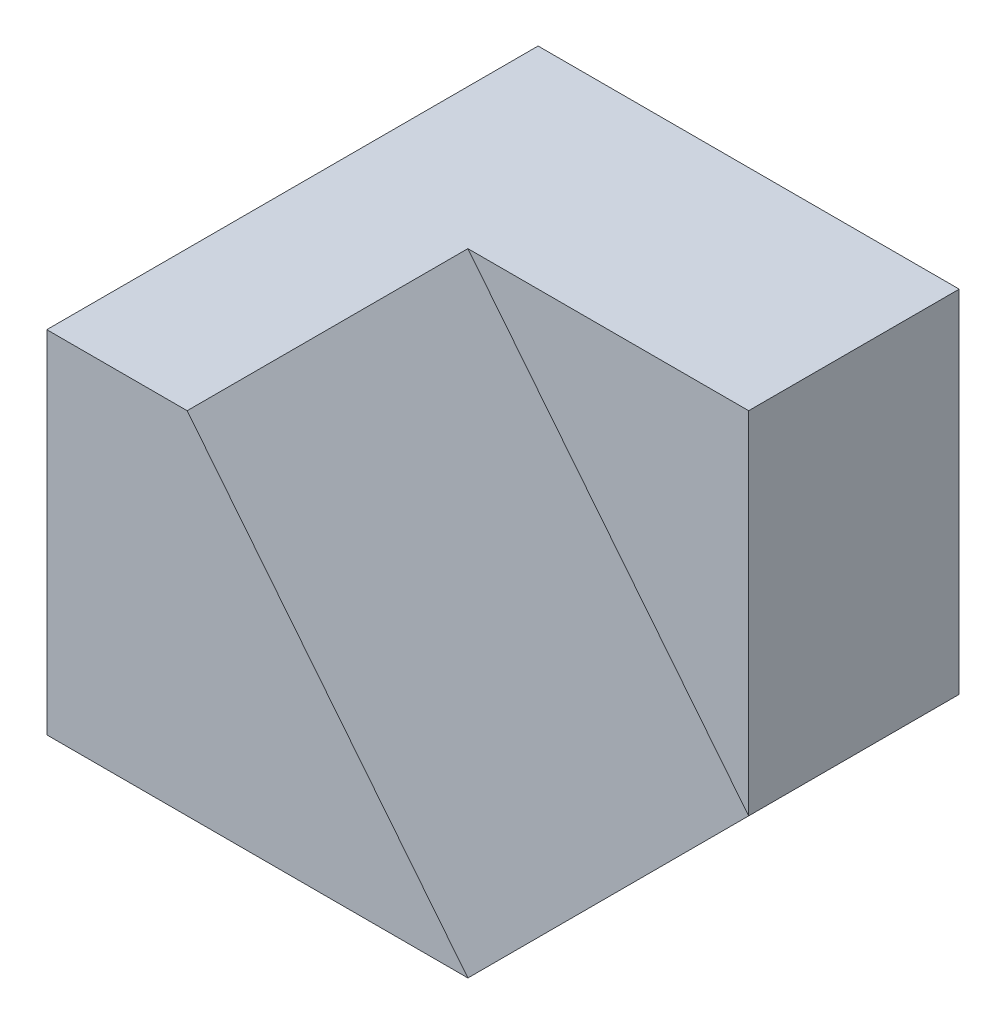
ISO-10303-21;
HEADER;
FILE_DESCRIPTION(('STEP AP214'),'2;1');
FILE_NAME('part.step','',(''),(''),'','','');
FILE_SCHEMA(('AUTOMOTIVE_DESIGN { 1 0 10303 214 1 1 1 1 }'));
ENDSEC;
DATA;
#1=APPLICATION_CONTEXT('core data for automotive mechanical design processes');
#2=APPLICATION_PROTOCOL_DEFINITION('international standard','automotive_design',2000,#1);
#3=PRODUCT_CONTEXT('',#1,'mechanical');
#4=PRODUCT('Part','Part','',(#3));
#5=PRODUCT_RELATED_PRODUCT_CATEGORY('part','',(#4));
#6=PRODUCT_DEFINITION_FORMATION('','',#4);
#7=PRODUCT_DEFINITION_CONTEXT('part definition',#1,'design');
#8=PRODUCT_DEFINITION('design','',#6,#7);
#9=PRODUCT_DEFINITION_SHAPE('','',#8);
#10=(LENGTH_UNIT() NAMED_UNIT(*) SI_UNIT(.MILLI.,.METRE.));
#11=(NAMED_UNIT(*) PLANE_ANGLE_UNIT() SI_UNIT($,.RADIAN.));
#12=(NAMED_UNIT(*) SI_UNIT($,.STERADIAN.) SOLID_ANGLE_UNIT());
#13=UNCERTAINTY_MEASURE_WITH_UNIT(LENGTH_MEASURE(1.E-05),#10,'distance_accuracy_value','');
#14=(GEOMETRIC_REPRESENTATION_CONTEXT(3) GLOBAL_UNCERTAINTY_ASSIGNED_CONTEXT((#13)) GLOBAL_UNIT_ASSIGNED_CONTEXT((#10,
#11,#12)) REPRESENTATION_CONTEXT('',''));
#15=CARTESIAN_POINT('',(0.,0.,0.));
#16=DIRECTION('',(0.,0.,1.));
#17=DIRECTION('',(1.,0.,0.));
#18=AXIS2_PLACEMENT_3D('',#15,#16,#17);
#19=CARTESIAN_POINT('',(0.,0.,40.));
#20=DIRECTION('',(1.,0.,0.));
#21=DIRECTION('',(0.,0.,-1.));
#22=AXIS2_PLACEMENT_3D('',#19,#20,#21);
#23=PLANE('',#22);
#24=DIRECTION('',(0.,0.,-1.));
#25=VECTOR('',#24,1.);
#26=CARTESIAN_POINT('',(0.,50.,40.));
#27=LINE('',#26,#25);
#28=CARTESIAN_POINT('',(0.,50.,40.));
#29=VERTEX_POINT('',#28);
#30=CARTESIAN_POINT('',(0.,50.,-30.));
#31=VERTEX_POINT('',#30);
#32=EDGE_CURVE('E138',#29,#31,#27,.T.);
#33=ORIENTED_EDGE('',*,*,#32,.T.);
#34=DIRECTION('',(0.,1.,0.));
#35=VECTOR('',#34,1.);
#36=CARTESIAN_POINT('',(0.,0.,-30.));
#37=LINE('',#36,#35);
#38=CARTESIAN_POINT('',(0.,0.,-30.));
#39=VERTEX_POINT('',#38);
#40=EDGE_CURVE('E100',#39,#31,#37,.T.);
#41=ORIENTED_EDGE('',*,*,#40,.F.);
#42=DIRECTION('',(0.,0.,-1.));
#43=VECTOR('',#42,1.);
#44=CARTESIAN_POINT('',(0.,0.,40.));
#45=LINE('',#44,#43);
#46=CARTESIAN_POINT('',(0.,0.,40.));
#47=VERTEX_POINT('',#46);
#48=EDGE_CURVE('E11',#47,#39,#45,.T.);
#49=ORIENTED_EDGE('',*,*,#48,.F.);
#50=DIRECTION('',(0.,-1.,0.));
#51=VECTOR('',#50,1.);
#52=CARTESIAN_POINT('',(0.,0.,40.));
#53=LINE('',#52,#51);
#54=EDGE_CURVE('E124',#29,#47,#53,.T.);
#55=ORIENTED_EDGE('',*,*,#54,.F.);
#56=EDGE_LOOP('',(#33,#41,#49,#55));
#57=FACE_BOUND('',#56,.T.);
#58=ADVANCED_FACE('F43',(#57),#23,.F.);
#59=CARTESIAN_POINT('',(0.,0.,40.));
#60=DIRECTION('',(0.,1.,0.));
#61=DIRECTION('',(0.,0.,1.));
#62=AXIS2_PLACEMENT_3D('',#59,#60,#61);
#63=PLANE('',#62);
#64=ORIENTED_EDGE('',*,*,#48,.T.);
#65=DIRECTION('',(-1.,0.,0.));
#66=VECTOR('',#65,1.);
#67=CARTESIAN_POINT('',(60.,0.,-30.));
#68=LINE('',#67,#66);
#69=CARTESIAN_POINT('',(60.,0.,-30.));
#70=VERTEX_POINT('',#69);
#71=EDGE_CURVE('E88',#70,#39,#68,.T.);
#72=ORIENTED_EDGE('',*,*,#71,.F.);
#73=DIRECTION('',(0.,0.,1.));
#74=VECTOR('',#73,1.);
#75=CARTESIAN_POINT('',(60.,0.,-30.));
#76=LINE('',#75,#74);
#77=CARTESIAN_POINT('',(60.,0.,0.));
#78=VERTEX_POINT('',#77);
#79=EDGE_CURVE('E93',#70,#78,#76,.T.);
#80=ORIENTED_EDGE('',*,*,#79,.T.);
#81=DIRECTION('',(0.,0.,-1.));
#82=VECTOR('',#81,1.);
#83=CARTESIAN_POINT('',(60.,0.,40.));
#84=LINE('',#83,#82);
#85=CARTESIAN_POINT('',(60.,0.,40.));
#86=VERTEX_POINT('',#85);
#87=EDGE_CURVE('E52',#86,#78,#84,.T.);
#88=ORIENTED_EDGE('',*,*,#87,.F.);
#89=DIRECTION('',(1.,0.,0.));
#90=VECTOR('',#89,1.);
#91=CARTESIAN_POINT('',(0.,0.,40.));
#92=LINE('',#91,#90);
#93=EDGE_CURVE('E131',#47,#86,#92,.T.);
#94=ORIENTED_EDGE('',*,*,#93,.F.);
#95=EDGE_LOOP('',(#64,#72,#80,#88,#94));
#96=FACE_BOUND('',#95,.T.);
#97=ADVANCED_FACE('F90',(#96),#63,.F.);
#98=CARTESIAN_POINT('',(20.,50.,40.));
#99=DIRECTION('',(-0.78086880944303,-0.624695047554424,0.));
#100=DIRECTION('',(0.624695047554424,-0.78086880944303,0.));
#101=AXIS2_PLACEMENT_3D('',#98,#99,#100);
#102=PLANE('',#101);
#103=DIRECTION('',(-0.624695047554424,0.78086880944303,0.));
#104=VECTOR('',#103,1.);
#105=CARTESIAN_POINT('',(20.,50.,0.));
#106=LINE('',#105,#104);
#107=CARTESIAN_POINT('',(20.,50.,0.));
#108=VERTEX_POINT('',#107);
#109=EDGE_CURVE('E118',#78,#108,#106,.T.);
#110=ORIENTED_EDGE('',*,*,#109,.T.);
#111=DIRECTION('',(0.,0.,-1.));
#112=VECTOR('',#111,1.);
#113=CARTESIAN_POINT('',(20.,50.,40.));
#114=LINE('',#113,#112);
#115=CARTESIAN_POINT('',(20.,50.,40.));
#116=VERTEX_POINT('',#115);
#117=EDGE_CURVE('E142',#116,#108,#114,.T.);
#118=ORIENTED_EDGE('',*,*,#117,.F.);
#119=DIRECTION('',(-0.624695047554424,0.78086880944303,0.));
#120=VECTOR('',#119,1.);
#121=CARTESIAN_POINT('',(20.,50.,40.));
#122=LINE('',#121,#120);
#123=EDGE_CURVE('E134',#86,#116,#122,.T.);
#124=ORIENTED_EDGE('',*,*,#123,.F.);
#125=ORIENTED_EDGE('',*,*,#87,.T.);
#126=EDGE_LOOP('',(#110,#118,#124,#125));
#127=FACE_BOUND('',#126,.T.);
#128=ADVANCED_FACE('F148',(#127),#102,.F.);
#129=CARTESIAN_POINT('',(0.,50.,40.));
#130=DIRECTION('',(0.,-1.,0.));
#131=DIRECTION('',(0.,0.,-1.));
#132=AXIS2_PLACEMENT_3D('',#129,#130,#131);
#133=PLANE('',#132);
#134=ORIENTED_EDGE('',*,*,#117,.T.);
#135=DIRECTION('',(1.,0.,0.));
#136=VECTOR('',#135,1.);
#137=CARTESIAN_POINT('',(60.,50.,0.));
#138=LINE('',#137,#136);
#139=CARTESIAN_POINT('',(60.,50.,0.));
#140=VERTEX_POINT('',#139);
#141=EDGE_CURVE('E111',#108,#140,#138,.T.);
#142=ORIENTED_EDGE('',*,*,#141,.T.);
#143=DIRECTION('',(0.,0.,1.));
#144=VECTOR('',#143,1.);
#145=CARTESIAN_POINT('',(60.,50.,-30.));
#146=LINE('',#145,#144);
#147=CARTESIAN_POINT('',(60.,50.,-30.));
#148=VERTEX_POINT('',#147);
#149=EDGE_CURVE('E119',#148,#140,#146,.T.);
#150=ORIENTED_EDGE('',*,*,#149,.F.);
#151=DIRECTION('',(1.,0.,0.));
#152=VECTOR('',#151,1.);
#153=CARTESIAN_POINT('',(60.,50.,-30.));
#154=LINE('',#153,#152);
#155=EDGE_CURVE('E106',#31,#148,#154,.T.);
#156=ORIENTED_EDGE('',*,*,#155,.F.);
#157=ORIENTED_EDGE('',*,*,#32,.F.);
#158=DIRECTION('',(-1.,0.,0.));
#159=VECTOR('',#158,1.);
#160=CARTESIAN_POINT('',(0.,50.,40.));
#161=LINE('',#160,#159);
#162=EDGE_CURVE('E59',#116,#29,#161,.T.);
#163=ORIENTED_EDGE('',*,*,#162,.F.);
#164=EDGE_LOOP('',(#134,#142,#150,#156,#157,#163));
#165=FACE_BOUND('',#164,.T.);
#166=ADVANCED_FACE('F162',(#165),#133,.F.);
#167=CARTESIAN_POINT('',(0.,0.,40.));
#168=DIRECTION('',(0.,0.,-1.));
#169=DIRECTION('',(-1.,0.,0.));
#170=AXIS2_PLACEMENT_3D('',#167,#168,#169);
#171=PLANE('',#170);
#172=ORIENTED_EDGE('',*,*,#54,.T.);
#173=ORIENTED_EDGE('',*,*,#93,.T.);
#174=ORIENTED_EDGE('',*,*,#123,.T.);
#175=ORIENTED_EDGE('',*,*,#162,.T.);
#176=EDGE_LOOP('',(#172,#173,#174,#175));
#177=FACE_BOUND('',#176,.T.);
#178=ADVANCED_FACE('F151',(#177),#171,.F.);
#179=CARTESIAN_POINT('',(0.,0.,0.));
#180=DIRECTION('',(0.,0.,1.));
#181=DIRECTION('',(1.,0.,0.));
#182=AXIS2_PLACEMENT_3D('',#179,#180,#181);
#183=PLANE('',#182);
#184=ORIENTED_EDGE('',*,*,#109,.F.);
#185=DIRECTION('',(0.,-1.,0.));
#186=VECTOR('',#185,1.);
#187=CARTESIAN_POINT('',(60.,0.,0.));
#188=LINE('',#187,#186);
#189=EDGE_CURVE('E115',#140,#78,#188,.T.);
#190=ORIENTED_EDGE('',*,*,#189,.F.);
#191=ORIENTED_EDGE('',*,*,#141,.F.);
#192=EDGE_LOOP('',(#184,#190,#191));
#193=FACE_BOUND('',#192,.T.);
#194=ADVANCED_FACE('F164',(#193),#183,.T.);
#195=CARTESIAN_POINT('',(60.,0.,-30.));
#196=DIRECTION('',(-1.,0.,0.));
#197=DIRECTION('',(0.,0.,1.));
#198=AXIS2_PLACEMENT_3D('',#195,#196,#197);
#199=PLANE('',#198);
#200=ORIENTED_EDGE('',*,*,#189,.T.);
#201=ORIENTED_EDGE('',*,*,#79,.F.);
#202=DIRECTION('',(0.,-1.,0.));
#203=VECTOR('',#202,1.);
#204=CARTESIAN_POINT('',(60.,0.,-30.));
#205=LINE('',#204,#203);
#206=EDGE_CURVE('E101',#148,#70,#205,.T.);
#207=ORIENTED_EDGE('',*,*,#206,.F.);
#208=ORIENTED_EDGE('',*,*,#149,.T.);
#209=EDGE_LOOP('',(#200,#201,#207,#208));
#210=FACE_BOUND('',#209,.T.);
#211=ADVANCED_FACE('F113',(#210),#199,.F.);
#212=CARTESIAN_POINT('',(0.,0.,-30.));
#213=DIRECTION('',(0.,0.,1.));
#214=DIRECTION('',(1.,0.,0.));
#215=AXIS2_PLACEMENT_3D('',#212,#213,#214);
#216=PLANE('',#215);
#217=ORIENTED_EDGE('',*,*,#206,.T.);
#218=ORIENTED_EDGE('',*,*,#71,.T.);
#219=ORIENTED_EDGE('',*,*,#40,.T.);
#220=ORIENTED_EDGE('',*,*,#155,.T.);
#221=EDGE_LOOP('',(#217,#218,#219,#220));
#222=FACE_BOUND('',#221,.T.);
#223=ADVANCED_FACE('F104',(#222),#216,.F.);
#224=CLOSED_SHELL('',(#58,#97,#128,#166,#178,#194,#211,#223));
#225=MANIFOLD_SOLID_BREP('B2',#224);
#226=ADVANCED_BREP_SHAPE_REPRESENTATION('',(#18,#225),#14);
#227=SHAPE_DEFINITION_REPRESENTATION(#9,#226);
ENDSEC;
END-ISO-10303-21;
